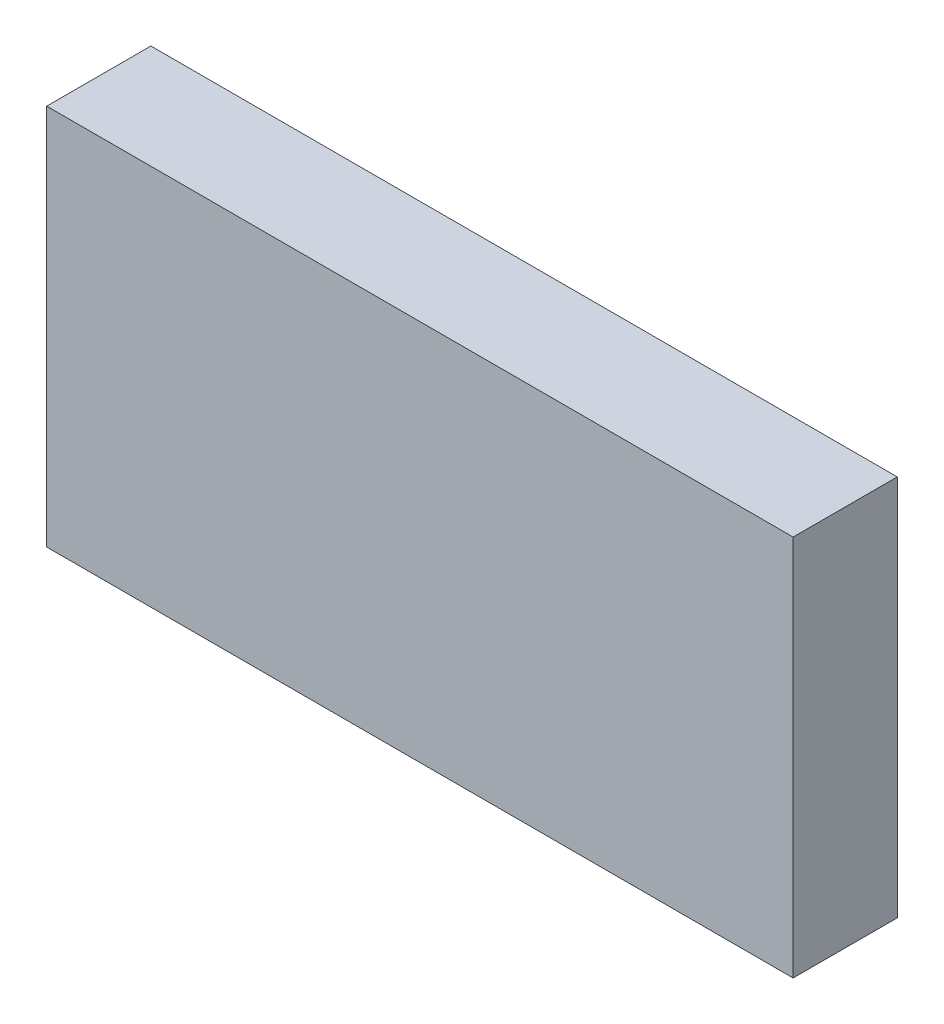
ISO-10303-21;
HEADER;
FILE_DESCRIPTION(('STEP AP214'),'2;1');
FILE_NAME('part.step','',(''),(''),'','','');
FILE_SCHEMA(('AUTOMOTIVE_DESIGN { 1 0 10303 214 1 1 1 1 }'));
ENDSEC;
DATA;
#1=APPLICATION_CONTEXT('core data for automotive mechanical design processes');
#2=APPLICATION_PROTOCOL_DEFINITION('international standard','automotive_design',2000,#1);
#3=PRODUCT_CONTEXT('',#1,'mechanical');
#4=PRODUCT('Part','Part','',(#3));
#5=PRODUCT_RELATED_PRODUCT_CATEGORY('part','',(#4));
#6=PRODUCT_DEFINITION_FORMATION('','',#4);
#7=PRODUCT_DEFINITION_CONTEXT('part definition',#1,'design');
#8=PRODUCT_DEFINITION('design','',#6,#7);
#9=PRODUCT_DEFINITION_SHAPE('','',#8);
#10=(LENGTH_UNIT() NAMED_UNIT(*) SI_UNIT(.MILLI.,.METRE.));
#11=(NAMED_UNIT(*) PLANE_ANGLE_UNIT() SI_UNIT($,.RADIAN.));
#12=(NAMED_UNIT(*) SI_UNIT($,.STERADIAN.) SOLID_ANGLE_UNIT());
#13=UNCERTAINTY_MEASURE_WITH_UNIT(LENGTH_MEASURE(1.E-05),#10,'distance_accuracy_value','');
#14=(GEOMETRIC_REPRESENTATION_CONTEXT(3) GLOBAL_UNCERTAINTY_ASSIGNED_CONTEXT((#13)) GLOBAL_UNIT_ASSIGNED_CONTEXT((#10,
#11,#12)) REPRESENTATION_CONTEXT('',''));
#15=CARTESIAN_POINT('',(0.,0.,0.));
#16=DIRECTION('',(0.,0.,1.));
#17=DIRECTION('',(1.,0.,0.));
#18=AXIS2_PLACEMENT_3D('',#15,#16,#17);
#19=CARTESIAN_POINT('',(-107.5,110.,-15.));
#20=DIRECTION('',(1.,0.,0.));
#21=DIRECTION('',(0.,0.,-1.));
#22=AXIS2_PLACEMENT_3D('',#19,#20,#21);
#23=PLANE('',#22);
#24=DIRECTION('',(0.,0.,1.));
#25=VECTOR('',#24,1.);
#26=CARTESIAN_POINT('',(-107.5,0.,-15.));
#27=LINE('',#26,#25);
#28=CARTESIAN_POINT('',(-107.5,0.,-15.));
#29=VERTEX_POINT('',#28);
#30=CARTESIAN_POINT('',(-107.5,0.,15.));
#31=VERTEX_POINT('',#30);
#32=EDGE_CURVE('E107',#29,#31,#27,.T.);
#33=ORIENTED_EDGE('',*,*,#32,.T.);
#34=DIRECTION('',(0.,-1.,0.));
#35=VECTOR('',#34,1.);
#36=CARTESIAN_POINT('',(-107.5,110.,15.));
#37=LINE('',#36,#35);
#38=CARTESIAN_POINT('',(-107.5,110.,15.));
#39=VERTEX_POINT('',#38);
#40=EDGE_CURVE('E11',#39,#31,#37,.T.);
#41=ORIENTED_EDGE('',*,*,#40,.F.);
#42=DIRECTION('',(0.,0.,1.));
#43=VECTOR('',#42,1.);
#44=CARTESIAN_POINT('',(-107.5,110.,-15.));
#45=LINE('',#44,#43);
#46=CARTESIAN_POINT('',(-107.5,110.,-15.));
#47=VERTEX_POINT('',#46);
#48=EDGE_CURVE('E91',#47,#39,#45,.T.);
#49=ORIENTED_EDGE('',*,*,#48,.F.);
#50=DIRECTION('',(0.,-1.,0.));
#51=VECTOR('',#50,1.);
#52=CARTESIAN_POINT('',(-107.5,110.,-15.));
#53=LINE('',#52,#51);
#54=EDGE_CURVE('E103',#47,#29,#53,.T.);
#55=ORIENTED_EDGE('',*,*,#54,.T.);
#56=EDGE_LOOP('',(#33,#41,#49,#55));
#57=FACE_BOUND('',#56,.T.);
#58=ADVANCED_FACE('F39',(#57),#23,.F.);
#59=CARTESIAN_POINT('',(-107.5,110.,15.));
#60=DIRECTION('',(0.,0.,-1.));
#61=DIRECTION('',(-1.,0.,0.));
#62=AXIS2_PLACEMENT_3D('',#59,#60,#61);
#63=PLANE('',#62);
#64=DIRECTION('',(1.,0.,0.));
#65=VECTOR('',#64,1.);
#66=CARTESIAN_POINT('',(-107.5,0.,15.));
#67=LINE('',#66,#65);
#68=CARTESIAN_POINT('',(107.5,0.,15.));
#69=VERTEX_POINT('',#68);
#70=EDGE_CURVE('E96',#31,#69,#67,.T.);
#71=ORIENTED_EDGE('',*,*,#70,.T.);
#72=DIRECTION('',(0.,-1.,0.));
#73=VECTOR('',#72,1.);
#74=CARTESIAN_POINT('',(107.5,110.,15.));
#75=LINE('',#74,#73);
#76=CARTESIAN_POINT('',(107.5,110.,15.));
#77=VERTEX_POINT('',#76);
#78=EDGE_CURVE('E48',#77,#69,#75,.T.);
#79=ORIENTED_EDGE('',*,*,#78,.F.);
#80=DIRECTION('',(1.,0.,0.));
#81=VECTOR('',#80,1.);
#82=CARTESIAN_POINT('',(-107.5,110.,15.));
#83=LINE('',#82,#81);
#84=EDGE_CURVE('E86',#39,#77,#83,.T.);
#85=ORIENTED_EDGE('',*,*,#84,.F.);
#86=ORIENTED_EDGE('',*,*,#40,.T.);
#87=EDGE_LOOP('',(#71,#79,#85,#86));
#88=FACE_BOUND('',#87,.T.);
#89=ADVANCED_FACE('F95',(#88),#63,.F.);
#90=CARTESIAN_POINT('',(107.5,110.,-15.));
#91=DIRECTION('',(-1.,0.,0.));
#92=DIRECTION('',(0.,0.,1.));
#93=AXIS2_PLACEMENT_3D('',#90,#91,#92);
#94=PLANE('',#93);
#95=DIRECTION('',(0.,0.,-1.));
#96=VECTOR('',#95,1.);
#97=CARTESIAN_POINT('',(107.5,0.,-15.));
#98=LINE('',#97,#96);
#99=CARTESIAN_POINT('',(107.5,0.,-15.));
#100=VERTEX_POINT('',#99);
#101=EDGE_CURVE('E73',#69,#100,#98,.T.);
#102=ORIENTED_EDGE('',*,*,#101,.T.);
#103=DIRECTION('',(0.,-1.,0.));
#104=VECTOR('',#103,1.);
#105=CARTESIAN_POINT('',(107.5,110.,-15.));
#106=LINE('',#105,#104);
#107=CARTESIAN_POINT('',(107.5,110.,-15.));
#108=VERTEX_POINT('',#107);
#109=EDGE_CURVE('E98',#108,#100,#106,.T.);
#110=ORIENTED_EDGE('',*,*,#109,.F.);
#111=DIRECTION('',(0.,0.,-1.));
#112=VECTOR('',#111,1.);
#113=CARTESIAN_POINT('',(107.5,110.,-15.));
#114=LINE('',#113,#112);
#115=EDGE_CURVE('E89',#77,#108,#114,.T.);
#116=ORIENTED_EDGE('',*,*,#115,.F.);
#117=ORIENTED_EDGE('',*,*,#78,.T.);
#118=EDGE_LOOP('',(#102,#110,#116,#117));
#119=FACE_BOUND('',#118,.T.);
#120=ADVANCED_FACE('F99',(#119),#94,.F.);
#121=CARTESIAN_POINT('',(-107.5,110.,-15.));
#122=DIRECTION('',(0.,0.,1.));
#123=DIRECTION('',(1.,0.,0.));
#124=AXIS2_PLACEMENT_3D('',#121,#122,#123);
#125=PLANE('',#124);
#126=DIRECTION('',(-1.,0.,0.));
#127=VECTOR('',#126,1.);
#128=CARTESIAN_POINT('',(-107.5,0.,-15.));
#129=LINE('',#128,#127);
#130=EDGE_CURVE('E79',#100,#29,#129,.T.);
#131=ORIENTED_EDGE('',*,*,#130,.T.);
#132=ORIENTED_EDGE('',*,*,#54,.F.);
#133=DIRECTION('',(-1.,0.,0.));
#134=VECTOR('',#133,1.);
#135=CARTESIAN_POINT('',(-107.5,110.,-15.));
#136=LINE('',#135,#134);
#137=EDGE_CURVE('E56',#108,#47,#136,.T.);
#138=ORIENTED_EDGE('',*,*,#137,.F.);
#139=ORIENTED_EDGE('',*,*,#109,.T.);
#140=EDGE_LOOP('',(#131,#132,#138,#139));
#141=FACE_BOUND('',#140,.T.);
#142=ADVANCED_FACE('F120',(#141),#125,.F.);
#143=CARTESIAN_POINT('',(0.,110.,0.));
#144=DIRECTION('',(0.,1.,0.));
#145=DIRECTION('',(0.,0.,1.));
#146=AXIS2_PLACEMENT_3D('',#143,#144,#145);
#147=PLANE('',#146);
#148=ORIENTED_EDGE('',*,*,#48,.T.);
#149=ORIENTED_EDGE('',*,*,#84,.T.);
#150=ORIENTED_EDGE('',*,*,#115,.T.);
#151=ORIENTED_EDGE('',*,*,#137,.T.);
#152=EDGE_LOOP('',(#148,#149,#150,#151));
#153=FACE_BOUND('',#152,.T.);
#154=ADVANCED_FACE('F87',(#153),#147,.T.);
#155=CARTESIAN_POINT('',(0.,0.,0.));
#156=DIRECTION('',(0.,1.,0.));
#157=DIRECTION('',(0.,0.,1.));
#158=AXIS2_PLACEMENT_3D('',#155,#156,#157);
#159=PLANE('',#158);
#160=ORIENTED_EDGE('',*,*,#32,.F.);
#161=ORIENTED_EDGE('',*,*,#130,.F.);
#162=ORIENTED_EDGE('',*,*,#101,.F.);
#163=ORIENTED_EDGE('',*,*,#70,.F.);
#164=EDGE_LOOP('',(#160,#161,#162,#163));
#165=FACE_BOUND('',#164,.T.);
#166=ADVANCED_FACE('F123',(#165),#159,.F.);
#167=CLOSED_SHELL('',(#58,#89,#120,#142,#154,#166));
#168=MANIFOLD_SOLID_BREP('B2',#167);
#169=ADVANCED_BREP_SHAPE_REPRESENTATION('',(#18,#168),#14);
#170=SHAPE_DEFINITION_REPRESENTATION(#9,#169);
ENDSEC;
END-ISO-10303-21;
